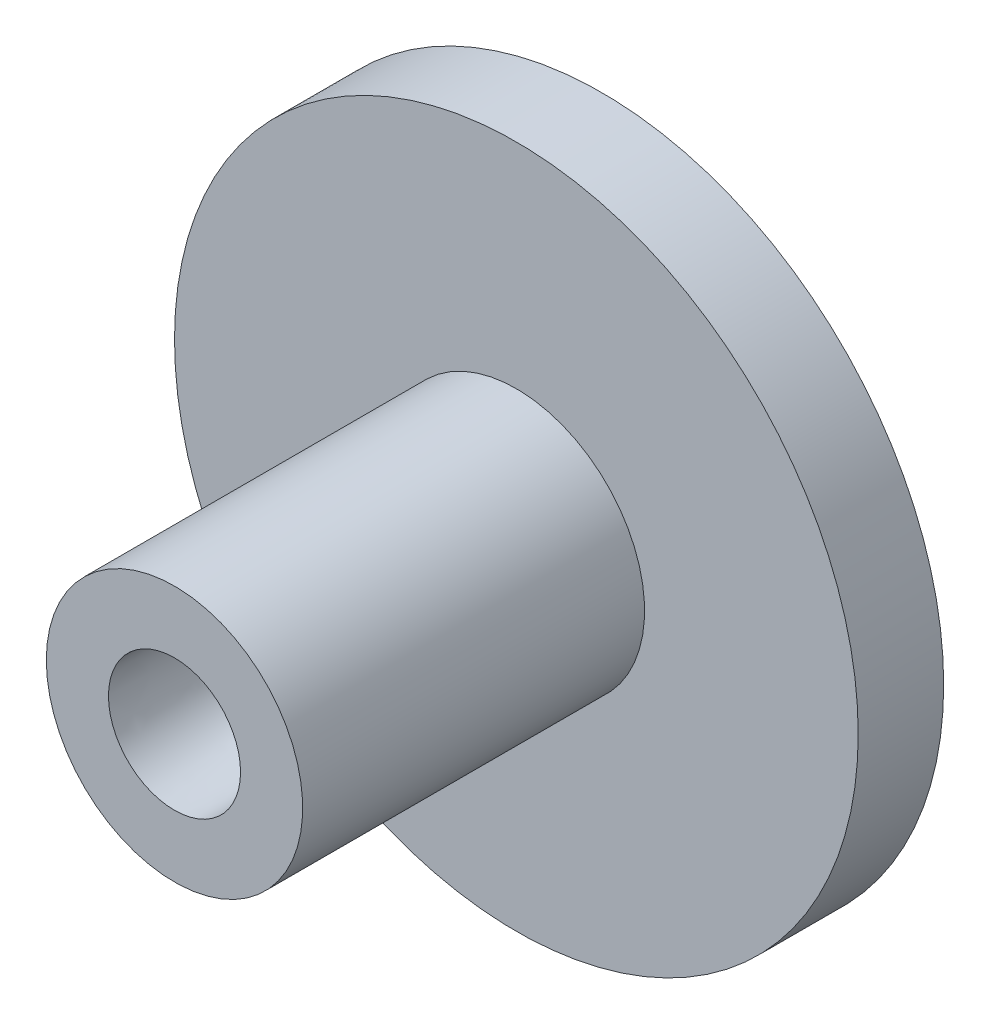
ISO-10303-21;
HEADER;
FILE_DESCRIPTION(('STEP AP214'),'2;1');
FILE_NAME('part.step','',(''),(''),'','','');
FILE_SCHEMA(('AUTOMOTIVE_DESIGN { 1 0 10303 214 1 1 1 1 }'));
ENDSEC;
DATA;
#1=APPLICATION_CONTEXT('core data for automotive mechanical design processes');
#2=APPLICATION_PROTOCOL_DEFINITION('international standard','automotive_design',2000,#1);
#3=PRODUCT_CONTEXT('',#1,'mechanical');
#4=PRODUCT('Part','Part','',(#3));
#5=PRODUCT_RELATED_PRODUCT_CATEGORY('part','',(#4));
#6=PRODUCT_DEFINITION_FORMATION('','',#4);
#7=PRODUCT_DEFINITION_CONTEXT('part definition',#1,'design');
#8=PRODUCT_DEFINITION('design','',#6,#7);
#9=PRODUCT_DEFINITION_SHAPE('','',#8);
#10=(LENGTH_UNIT() NAMED_UNIT(*) SI_UNIT(.MILLI.,.METRE.));
#11=(NAMED_UNIT(*) PLANE_ANGLE_UNIT() SI_UNIT($,.RADIAN.));
#12=(NAMED_UNIT(*) SI_UNIT($,.STERADIAN.) SOLID_ANGLE_UNIT());
#13=UNCERTAINTY_MEASURE_WITH_UNIT(LENGTH_MEASURE(1.E-05),#10,'distance_accuracy_value','');
#14=(GEOMETRIC_REPRESENTATION_CONTEXT(3) GLOBAL_UNCERTAINTY_ASSIGNED_CONTEXT((#13)) GLOBAL_UNIT_ASSIGNED_CONTEXT((#10,
#11,#12)) REPRESENTATION_CONTEXT('',''));
#15=CARTESIAN_POINT('',(0.,0.,0.));
#16=DIRECTION('',(0.,0.,1.));
#17=DIRECTION('',(1.,0.,0.));
#18=AXIS2_PLACEMENT_3D('',#15,#16,#17);
#19=CARTESIAN_POINT('',(0.,0.,5.));
#20=DIRECTION('',(0.,0.,-1.));
#21=DIRECTION('',(-1.,0.,0.));
#22=AXIS2_PLACEMENT_3D('',#19,#20,#21);
#23=CYLINDRICAL_SURFACE('',#22,20.);
#24=CARTESIAN_POINT('',(0.,0.,5.));
#25=DIRECTION('',(0.,0.,1.));
#26=DIRECTION('',(1.,0.,0.));
#27=AXIS2_PLACEMENT_3D('',#24,#25,#26);
#28=CIRCLE('',#27,20.);
#29=CARTESIAN_POINT('',(20.,0.,5.));
#30=VERTEX_POINT('',#29);
#31=EDGE_CURVE('E11',#30,#30,#28,.T.);
#32=ORIENTED_EDGE('',*,*,#31,.F.);
#33=EDGE_LOOP('',(#32));
#34=FACE_BOUND('',#33,.T.);
#35=CARTESIAN_POINT('',(0.,0.,0.));
#36=DIRECTION('',(0.,0.,1.));
#37=DIRECTION('',(1.,0.,0.));
#38=AXIS2_PLACEMENT_3D('',#35,#36,#37);
#39=CIRCLE('',#38,20.);
#40=CARTESIAN_POINT('',(20.,0.,0.));
#41=VERTEX_POINT('',#40);
#42=EDGE_CURVE('E36',#41,#41,#39,.T.);
#43=ORIENTED_EDGE('',*,*,#42,.T.);
#44=EDGE_LOOP('',(#43));
#45=FACE_BOUND('',#44,.T.);
#46=ADVANCED_FACE('F33',(#34,#45),#23,.T.);
#47=CARTESIAN_POINT('',(0.,0.,5.));
#48=DIRECTION('',(0.,0.,1.));
#49=DIRECTION('',(1.,0.,0.));
#50=AXIS2_PLACEMENT_3D('',#47,#48,#49);
#51=PLANE('',#50);
#52=CARTESIAN_POINT('',(0.,0.,5.));
#53=DIRECTION('',(0.,0.,-1.));
#54=DIRECTION('',(-1.,0.,0.));
#55=AXIS2_PLACEMENT_3D('',#52,#53,#54);
#56=CIRCLE('',#55,7.5);
#57=CARTESIAN_POINT('',(-7.5,0.,5.));
#58=VERTEX_POINT('',#57);
#59=EDGE_CURVE('E69',#58,#58,#56,.T.);
#60=ORIENTED_EDGE('',*,*,#59,.T.);
#61=EDGE_LOOP('',(#60));
#62=FACE_BOUND('',#61,.T.);
#63=ORIENTED_EDGE('',*,*,#31,.T.);
#64=EDGE_LOOP('',(#63));
#65=FACE_BOUND('',#64,.T.);
#66=ADVANCED_FACE('F56',(#62,#65),#51,.T.);
#67=CARTESIAN_POINT('',(0.,0.,0.));
#68=DIRECTION('',(0.,0.,1.));
#69=DIRECTION('',(1.,0.,0.));
#70=AXIS2_PLACEMENT_3D('',#67,#68,#69);
#71=PLANE('',#70);
#72=ORIENTED_EDGE('',*,*,#42,.F.);
#73=EDGE_LOOP('',(#72));
#74=FACE_BOUND('',#73,.T.);
#75=ADVANCED_FACE('F61',(#74),#71,.F.);
#76=CARTESIAN_POINT('',(0.,0.,5.));
#77=DIRECTION('',(0.,0.,-1.));
#78=DIRECTION('',(-1.,0.,0.));
#79=AXIS2_PLACEMENT_3D('',#76,#77,#78);
#80=CYLINDRICAL_SURFACE('',#79,7.5);
#81=ORIENTED_EDGE('',*,*,#59,.F.);
#82=EDGE_LOOP('',(#81));
#83=FACE_BOUND('',#82,.T.);
#84=CARTESIAN_POINT('',(0.,0.,25.));
#85=DIRECTION('',(0.,0.,-1.));
#86=DIRECTION('',(-1.,0.,0.));
#87=AXIS2_PLACEMENT_3D('',#84,#85,#86);
#88=CIRCLE('',#87,7.5);
#89=CARTESIAN_POINT('',(-7.5,0.,25.));
#90=VERTEX_POINT('',#89);
#91=EDGE_CURVE('E71',#90,#90,#88,.T.);
#92=ORIENTED_EDGE('',*,*,#91,.T.);
#93=EDGE_LOOP('',(#92));
#94=FACE_BOUND('',#93,.T.);
#95=ADVANCED_FACE('F50',(#83,#94),#80,.T.);
#96=CARTESIAN_POINT('',(7.5,0.,25.));
#97=DIRECTION('',(0.,0.,-1.));
#98=DIRECTION('',(-1.,0.,0.));
#99=AXIS2_PLACEMENT_3D('',#96,#97,#98);
#100=PLANE('',#99);
#101=ORIENTED_EDGE('',*,*,#91,.F.);
#102=EDGE_LOOP('',(#101));
#103=FACE_BOUND('',#102,.T.);
#104=CARTESIAN_POINT('',(0.,0.,25.));
#105=DIRECTION('',(0.,0.,-1.));
#106=DIRECTION('',(-1.,0.,0.));
#107=AXIS2_PLACEMENT_3D('',#104,#105,#106);
#108=CIRCLE('',#107,3.86331976943568);
#109=CARTESIAN_POINT('',(-3.86331976943568,0.,25.));
#110=VERTEX_POINT('',#109);
#111=EDGE_CURVE('E75',#110,#110,#108,.T.);
#112=ORIENTED_EDGE('',*,*,#111,.T.);
#113=EDGE_LOOP('',(#112));
#114=FACE_BOUND('',#113,.T.);
#115=ADVANCED_FACE('F44',(#103,#114),#100,.F.);
#116=CARTESIAN_POINT('',(0.,0.,8.99118561778778));
#117=CARTESIAN_POINT('',(2.82958522245403,0.,12.9078883297087));
#118=CARTESIAN_POINT('',(3.66830171070995,0.,16.6732991890435));
#119=CARTESIAN_POINT('',(3.86331976943568,0.,25.));
#120=B_SPLINE_CURVE_WITH_KNOTS('',3,(#116,#117,#118,#119),.UNSPECIFIED.,.F.,.F.,(4,4),(0.,1.),.UNSPECIFIED.);
#121=CARTESIAN_POINT('',(0.,0.,5.));
#122=DIRECTION('',(0.,0.,-1.));
#123=AXIS1_PLACEMENT('',#121,#122);
#124=SURFACE_OF_REVOLUTION('',#120,#123);
#125=ORIENTED_EDGE('',*,*,#111,.F.);
#126=EDGE_LOOP('',(#125));
#127=FACE_BOUND('',#126,.T.);
#128=CARTESIAN_POINT('',(0.,0.,8.99118561778778));
#129=VERTEX_POINT('',#128);
#130=VERTEX_LOOP('',#129);
#131=FACE_BOUND('',#130,.T.);
#132=ADVANCED_FACE('F42',(#127,#131),#124,.T.);
#133=CLOSED_SHELL('',(#46,#66,#75,#95,#115,#132));
#134=MANIFOLD_SOLID_BREP('B2',#133);
#135=ADVANCED_BREP_SHAPE_REPRESENTATION('',(#18,#134),#14);
#136=SHAPE_DEFINITION_REPRESENTATION(#9,#135);
ENDSEC;
END-ISO-10303-21;
